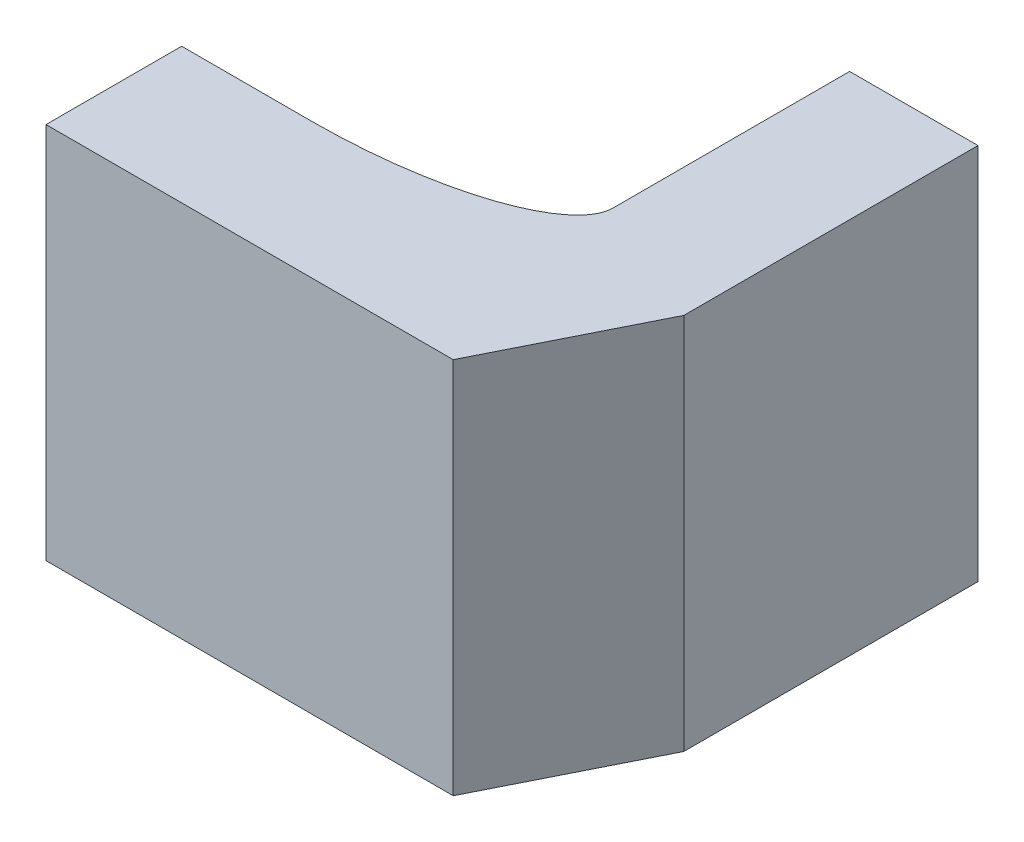
ISO-10303-21;
HEADER;
FILE_DESCRIPTION(('STEP AP214'),'2;1');
FILE_NAME('part.step','',(''),(''),'','','');
FILE_SCHEMA(('AUTOMOTIVE_DESIGN { 1 0 10303 214 1 1 1 1 }'));
ENDSEC;
DATA;
#1=APPLICATION_CONTEXT('core data for automotive mechanical design processes');
#2=APPLICATION_PROTOCOL_DEFINITION('international standard','automotive_design',2000,#1);
#3=PRODUCT_CONTEXT('',#1,'mechanical');
#4=PRODUCT('Part','Part','',(#3));
#5=PRODUCT_RELATED_PRODUCT_CATEGORY('part','',(#4));
#6=PRODUCT_DEFINITION_FORMATION('','',#4);
#7=PRODUCT_DEFINITION_CONTEXT('part definition',#1,'design');
#8=PRODUCT_DEFINITION('design','',#6,#7);
#9=PRODUCT_DEFINITION_SHAPE('','',#8);
#10=(LENGTH_UNIT() NAMED_UNIT(*) SI_UNIT(.MILLI.,.METRE.));
#11=(NAMED_UNIT(*) PLANE_ANGLE_UNIT() SI_UNIT($,.RADIAN.));
#12=(NAMED_UNIT(*) SI_UNIT($,.STERADIAN.) SOLID_ANGLE_UNIT());
#13=UNCERTAINTY_MEASURE_WITH_UNIT(LENGTH_MEASURE(1.E-05),#10,'distance_accuracy_value','');
#14=(GEOMETRIC_REPRESENTATION_CONTEXT(3) GLOBAL_UNCERTAINTY_ASSIGNED_CONTEXT((#13)) GLOBAL_UNIT_ASSIGNED_CONTEXT((#10,
#11,#12)) REPRESENTATION_CONTEXT('',''));
#15=CARTESIAN_POINT('',(0.,0.,0.));
#16=DIRECTION('',(0.,0.,1.));
#17=DIRECTION('',(1.,0.,0.));
#18=AXIS2_PLACEMENT_3D('',#15,#16,#17);
#19=CARTESIAN_POINT('',(0.,50.,-17.959481216458));
#20=DIRECTION('',(1.,0.,0.));
#21=DIRECTION('',(0.,0.,-1.));
#22=AXIS2_PLACEMENT_3D('',#19,#20,#21);
#23=PLANE('',#22);
#24=DIRECTION('',(0.,0.,1.));
#25=VECTOR('',#24,1.);
#26=CARTESIAN_POINT('',(0.,0.,-17.959481216458));
#27=LINE('',#26,#25);
#28=CARTESIAN_POINT('',(0.,0.,-17.959481216458));
#29=VERTEX_POINT('',#28);
#30=CARTESIAN_POINT('',(0.,0.,0.));
#31=VERTEX_POINT('',#30);
#32=EDGE_CURVE('E136',#29,#31,#27,.T.);
#33=ORIENTED_EDGE('',*,*,#32,.T.);
#34=DIRECTION('',(0.,-1.,0.));
#35=VECTOR('',#34,1.);
#36=CARTESIAN_POINT('',(0.,50.,0.));
#37=LINE('',#36,#35);
#38=CARTESIAN_POINT('',(0.,50.,0.));
#39=VERTEX_POINT('',#38);
#40=EDGE_CURVE('E122',#39,#31,#37,.T.);
#41=ORIENTED_EDGE('',*,*,#40,.F.);
#42=DIRECTION('',(0.,0.,1.));
#43=VECTOR('',#42,1.);
#44=CARTESIAN_POINT('',(0.,50.,-17.959481216458));
#45=LINE('',#44,#43);
#46=CARTESIAN_POINT('',(0.,50.,-17.959481216458));
#47=VERTEX_POINT('',#46);
#48=EDGE_CURVE('E129',#47,#39,#45,.T.);
#49=ORIENTED_EDGE('',*,*,#48,.F.);
#50=DIRECTION('',(0.,-1.,0.));
#51=VECTOR('',#50,1.);
#52=CARTESIAN_POINT('',(0.,50.,-17.959481216458));
#53=LINE('',#52,#51);
#54=EDGE_CURVE('E157',#47,#29,#53,.T.);
#55=ORIENTED_EDGE('',*,*,#54,.T.);
#56=EDGE_LOOP('',(#33,#41,#49,#55));
#57=FACE_BOUND('',#56,.T.);
#58=ADVANCED_FACE('F42',(#57),#23,.F.);
#59=CARTESIAN_POINT('',(0.,50.,0.));
#60=DIRECTION('',(0.,0.,-1.));
#61=DIRECTION('',(-1.,0.,0.));
#62=AXIS2_PLACEMENT_3D('',#59,#60,#61);
#63=PLANE('',#62);
#64=DIRECTION('',(1.,0.,0.));
#65=VECTOR('',#64,1.);
#66=CARTESIAN_POINT('',(0.,0.,0.));
#67=LINE('',#66,#65);
#68=CARTESIAN_POINT('',(53.9091998294495,0.,0.));
#69=VERTEX_POINT('',#68);
#70=EDGE_CURVE('E181',#31,#69,#67,.T.);
#71=ORIENTED_EDGE('',*,*,#70,.T.);
#72=DIRECTION('',(0.,-1.,0.));
#73=VECTOR('',#72,1.);
#74=CARTESIAN_POINT('',(53.9091998294495,50.,0.));
#75=LINE('',#74,#73);
#76=CARTESIAN_POINT('',(53.9091998294495,50.,0.));
#77=VERTEX_POINT('',#76);
#78=EDGE_CURVE('E121',#77,#69,#75,.T.);
#79=ORIENTED_EDGE('',*,*,#78,.F.);
#80=DIRECTION('',(1.,0.,0.));
#81=VECTOR('',#80,1.);
#82=CARTESIAN_POINT('',(0.,50.,0.));
#83=LINE('',#82,#81);
#84=EDGE_CURVE('E120',#39,#77,#83,.T.);
#85=ORIENTED_EDGE('',*,*,#84,.F.);
#86=ORIENTED_EDGE('',*,*,#40,.T.);
#87=EDGE_LOOP('',(#71,#79,#85,#86));
#88=FACE_BOUND('',#87,.T.);
#89=ADVANCED_FACE('F118',(#88),#63,.F.);
#90=CARTESIAN_POINT('',(53.9091998294495,50.,0.));
#91=DIRECTION('',(-0.894084951768094,0.,-0.447897420200033));
#92=DIRECTION('',(-0.447897420200033,0.,0.894084951768094));
#93=AXIS2_PLACEMENT_3D('',#90,#91,#92);
#94=PLANE('',#93);
#95=DIRECTION('',(0.447897420200033,0.,-0.894084951768094));
#96=VECTOR('',#95,1.);
#97=CARTESIAN_POINT('',(53.9091998294495,0.,0.));
#98=LINE('',#97,#96);
#99=CARTESIAN_POINT('',(64.0964881049183,0.,-20.335685662919));
#100=VERTEX_POINT('',#99);
#101=EDGE_CURVE('E178',#69,#100,#98,.T.);
#102=ORIENTED_EDGE('',*,*,#101,.T.);
#103=DIRECTION('',(0.,-1.,0.));
#104=VECTOR('',#103,1.);
#105=CARTESIAN_POINT('',(64.0964881049183,50.,-20.335685662919));
#106=LINE('',#105,#104);
#107=CARTESIAN_POINT('',(64.0964881049183,50.,-20.335685662919));
#108=VERTEX_POINT('',#107);
#109=EDGE_CURVE('E144',#108,#100,#106,.T.);
#110=ORIENTED_EDGE('',*,*,#109,.F.);
#111=DIRECTION('',(0.447897420200033,0.,-0.894084951768094));
#112=VECTOR('',#111,1.);
#113=CARTESIAN_POINT('',(53.9091998294495,50.,0.));
#114=LINE('',#113,#112);
#115=EDGE_CURVE('E130',#77,#108,#114,.T.);
#116=ORIENTED_EDGE('',*,*,#115,.F.);
#117=ORIENTED_EDGE('',*,*,#78,.T.);
#118=EDGE_LOOP('',(#102,#110,#116,#117));
#119=FACE_BOUND('',#118,.T.);
#120=ADVANCED_FACE('F218',(#119),#94,.F.);
#121=CARTESIAN_POINT('',(64.0964881049183,50.,-20.335685662919));
#122=DIRECTION('',(-1.,0.,0.));
#123=DIRECTION('',(0.,0.,1.));
#124=AXIS2_PLACEMENT_3D('',#121,#122,#123);
#125=PLANE('',#124);
#126=DIRECTION('',(0.,0.,-1.));
#127=VECTOR('',#126,1.);
#128=CARTESIAN_POINT('',(64.0964881049183,0.,-20.335685662919));
#129=LINE('',#128,#127);
#130=CARTESIAN_POINT('',(64.0964881049183,0.,-59.2855992844365));
#131=VERTEX_POINT('',#130);
#132=EDGE_CURVE('E175',#100,#131,#129,.T.);
#133=ORIENTED_EDGE('',*,*,#132,.T.);
#134=DIRECTION('',(0.,-1.,0.));
#135=VECTOR('',#134,1.);
#136=CARTESIAN_POINT('',(64.0964881049183,50.,-59.2855992844365));
#137=LINE('',#136,#135);
#138=CARTESIAN_POINT('',(64.0964881049183,50.,-59.2855992844365));
#139=VERTEX_POINT('',#138);
#140=EDGE_CURVE('E161',#139,#131,#137,.T.);
#141=ORIENTED_EDGE('',*,*,#140,.F.);
#142=DIRECTION('',(0.,0.,-1.));
#143=VECTOR('',#142,1.);
#144=CARTESIAN_POINT('',(64.0964881049183,50.,-20.335685662919));
#145=LINE('',#144,#143);
#146=EDGE_CURVE('E173',#108,#139,#145,.T.);
#147=ORIENTED_EDGE('',*,*,#146,.F.);
#148=ORIENTED_EDGE('',*,*,#109,.T.);
#149=EDGE_LOOP('',(#133,#141,#147,#148));
#150=FACE_BOUND('',#149,.T.);
#151=ADVANCED_FACE('F167',(#150),#125,.F.);
#152=CARTESIAN_POINT('',(64.0964881049183,50.,-59.2855992844365));
#153=DIRECTION('',(0.,0.,1.));
#154=DIRECTION('',(1.,0.,0.));
#155=AXIS2_PLACEMENT_3D('',#152,#153,#154);
#156=PLANE('',#155);
#157=DIRECTION('',(-1.,0.,0.));
#158=VECTOR('',#157,1.);
#159=CARTESIAN_POINT('',(64.0964881049183,0.,-59.2855992844365));
#160=LINE('',#159,#158);
#161=CARTESIAN_POINT('',(47.1025703947216,0.,-59.2855992844365));
#162=VERTEX_POINT('',#161);
#163=EDGE_CURVE('E177',#131,#162,#160,.T.);
#164=ORIENTED_EDGE('',*,*,#163,.T.);
#165=DIRECTION('',(0.,-1.,0.));
#166=VECTOR('',#165,1.);
#167=CARTESIAN_POINT('',(47.1025703947216,50.,-59.2855992844365));
#168=LINE('',#167,#166);
#169=CARTESIAN_POINT('',(47.1025703947216,50.,-59.2855992844365));
#170=VERTEX_POINT('',#169);
#171=EDGE_CURVE('E156',#170,#162,#168,.T.);
#172=ORIENTED_EDGE('',*,*,#171,.F.);
#173=DIRECTION('',(-1.,0.,0.));
#174=VECTOR('',#173,1.);
#175=CARTESIAN_POINT('',(64.0964881049183,50.,-59.2855992844365));
#176=LINE('',#175,#174);
#177=EDGE_CURVE('E186',#139,#170,#176,.T.);
#178=ORIENTED_EDGE('',*,*,#177,.F.);
#179=ORIENTED_EDGE('',*,*,#140,.T.);
#180=EDGE_LOOP('',(#164,#172,#178,#179));
#181=FACE_BOUND('',#180,.T.);
#182=ADVANCED_FACE('F212',(#181),#156,.F.);
#183=CARTESIAN_POINT('',(47.1025703947216,50.,-17.959481216458));
#184=DIRECTION('',(1.,0.,0.));
#185=DIRECTION('',(0.,0.,-1.));
#186=AXIS2_PLACEMENT_3D('',#183,#184,#185);
#187=PLANE('',#186);
#188=DIRECTION('',(0.,0.,1.));
#189=VECTOR('',#188,1.);
#190=CARTESIAN_POINT('',(47.1025703947216,0.,-17.959481216458));
#191=LINE('',#190,#189);
#192=CARTESIAN_POINT('',(47.1025703947216,0.,-37.9619154763347));
#193=VERTEX_POINT('',#192);
#194=EDGE_CURVE('E148',#162,#193,#191,.T.);
#195=ORIENTED_EDGE('',*,*,#194,.T.);
#196=CARTESIAN_POINT('',(47.1025703947216,52.5000000000001,-27.959481216458));
#197=CARTESIAN_POINT('',(47.1025703947216,51.3541666666688,-27.959481216458));
#198=CARTESIAN_POINT('',(47.1025703947216,50.2083333333307,-27.9445984041427));
#199=CARTESIAN_POINT('',(47.1025703947216,47.9166666666694,-27.9951941068982));
#200=CARTESIAN_POINT('',(47.1025703947216,46.7708333333267,-28.0659851228949));
#201=CARTESIAN_POINT('',(47.1025703947216,43.3333333333467,-28.395340591084));
#202=CARTESIAN_POINT('',(47.1025703947216,41.0416666666692,-28.7708874668256));
#203=CARTESIAN_POINT('',(47.1025703947216,34.1666666666615,-30.2094812157227));
#204=CARTESIAN_POINT('',(47.1025703947216,29.5833333333305,-31.5844812171815));
#205=CARTESIAN_POINT('',(47.1025703947216,20.4166666666695,-34.3344812157344));
#206=CARTESIAN_POINT('',(47.1025703947216,15.8333333333384,-35.7094812171694));
#207=CARTESIAN_POINT('',(47.1025703947216,8.95833333333078,-37.1480749661023));
#208=CARTESIAN_POINT('',(47.1025703947216,6.6666666666692,-37.523621841816));
#209=CARTESIAN_POINT('',(47.1025703947216,3.22916666666538,-37.8529773100289));
#210=CARTESIAN_POINT('',(47.1025703947216,2.08333333332267,-37.9237683260137));
#211=CARTESIAN_POINT('',(47.1025703947216,-0.208333333322687,-37.9743640287772));
#212=CARTESIAN_POINT('',(47.1025703947216,-1.35416666667469,-37.959481216458));
#213=CARTESIAN_POINT('',(47.1025703947216,-2.5,-37.959481216458));
#214=(BOUNDED_CURVE() B_SPLINE_CURVE(3,(#196,#197,#198,#199,#200,#201,#202,#203,#204,#205,#206,
#207,#208,#209,#210,#211,#212,#213),.UNSPECIFIED.,.F.,.F.) B_SPLINE_CURVE_WITH_KNOTS((4,2,2,2,2,
2,2,2,4),(0.0416666666666664,0.0989583333333331,0.15625,0.270833333333333,0.5,0.729166666666668,
0.843750000000001,0.901041666666668,0.958333333333335),
.UNSPECIFIED.) CURVE() GEOMETRIC_REPRESENTATION_ITEM() RATIONAL_B_SPLINE_CURVE((1.,1.,1.,1.,1.,
1.,1.,1.,1.,1.,1.,1.,1.,1.,1.,1.,1.,1.)) REPRESENTATION_ITEM(''));
#215=CARTESIAN_POINT('',(47.1025703947216,50.,-27.957046956583));
#216=VERTEX_POINT('',#215);
#217=EDGE_CURVE('E63',#193,#216,#214,.F.);
#218=ORIENTED_EDGE('',*,*,#217,.T.);
#219=DIRECTION('',(0.,0.,1.));
#220=VECTOR('',#219,1.);
#221=CARTESIAN_POINT('',(47.1025703947216,50.,-17.959481216458));
#222=LINE('',#221,#220);
#223=EDGE_CURVE('E195',#170,#216,#222,.T.);
#224=ORIENTED_EDGE('',*,*,#223,.F.);
#225=ORIENTED_EDGE('',*,*,#171,.T.);
#226=EDGE_LOOP('',(#195,#218,#224,#225));
#227=FACE_BOUND('',#226,.T.);
#228=ADVANCED_FACE('F199',(#227),#187,.F.);
#229=CARTESIAN_POINT('',(47.1025703947216,50.,-17.959481216458));
#230=DIRECTION('',(0.,0.,1.));
#231=DIRECTION('',(1.,0.,0.));
#232=AXIS2_PLACEMENT_3D('',#229,#230,#231);
#233=PLANE('',#232);
#234=DIRECTION('',(-1.,0.,0.));
#235=VECTOR('',#234,1.);
#236=CARTESIAN_POINT('',(47.1025703947216,50.,-17.959481216458));
#237=LINE('',#236,#235);
#238=CARTESIAN_POINT('',(17.1001361348466,50.,-17.959481216458));
#239=VERTEX_POINT('',#238);
#240=EDGE_CURVE('E132',#239,#47,#237,.T.);
#241=ORIENTED_EDGE('',*,*,#240,.F.);
#242=CARTESIAN_POINT('',(27.1025703947216,-2.5,-17.959481216458));
#243=CARTESIAN_POINT('',(27.1025703947216,-1.35416666667469,-17.959481216458));
#244=CARTESIAN_POINT('',(27.1174532070348,-0.208333333322687,-17.959481216458));
#245=CARTESIAN_POINT('',(27.0668575042833,2.08333333332267,-17.959481216458));
#246=CARTESIAN_POINT('',(26.9960664882826,3.22916666666538,-17.959481216458));
#247=CARTESIAN_POINT('',(26.6667110200995,6.6666666666692,-17.959481216458));
#248=CARTESIAN_POINT('',(26.29116414435,8.95833333333078,-17.959481216458));
#249=CARTESIAN_POINT('',(24.8525703954648,15.8333333333384,-17.959481216458));
#250=CARTESIAN_POINT('',(23.477570393998,20.4166666666695,-17.959481216458));
#251=CARTESIAN_POINT('',(20.7275703954451,29.5833333333305,-17.959481216458));
#252=CARTESIAN_POINT('',(19.3525703940022,34.1666666666615,-17.959481216458));
#253=CARTESIAN_POINT('',(17.9139766450812,41.0416666666692,-17.959481216458));
#254=CARTESIAN_POINT('',(17.5384297693635,43.3333333333467,-17.959481216458));
#255=CARTESIAN_POINT('',(17.2090743011506,46.7708333333267,-17.959481216458));
#256=CARTESIAN_POINT('',(17.1382832851618,47.9166666666694,-17.959481216458));
#257=CARTESIAN_POINT('',(17.0876875824063,50.2083333333307,-17.959481216458));
#258=CARTESIAN_POINT('',(17.1025703947216,51.3541666666688,-17.959481216458));
#259=CARTESIAN_POINT('',(17.1025703947216,52.5000000000001,-17.959481216458));
#260=(BOUNDED_CURVE() B_SPLINE_CURVE(3,(#242,#243,#244,#245,#246,#247,#248,#249,#250,#251,#252,
#253,#254,#255,#256,#257,#258,#259),.UNSPECIFIED.,.F.,.F.) B_SPLINE_CURVE_WITH_KNOTS((4,2,2,2,2,
2,2,2,4),(0.0416666666666663,0.098958333333333,0.15625,0.270833333333333,0.5,0.729166666666667,
0.843750000000001,0.901041666666668,0.958333333333334),
.UNSPECIFIED.) CURVE() GEOMETRIC_REPRESENTATION_ITEM() RATIONAL_B_SPLINE_CURVE((1.,1.,1.,1.,1.,
1.,1.,1.,1.,1.,1.,1.,1.,1.,1.,1.,1.,1.)) REPRESENTATION_ITEM(''));
#261=CARTESIAN_POINT('',(27.1050046545957,0.,-17.959481216458));
#262=VERTEX_POINT('',#261);
#263=EDGE_CURVE('E142',#239,#262,#260,.F.);
#264=ORIENTED_EDGE('',*,*,#263,.T.);
#265=DIRECTION('',(-1.,0.,0.));
#266=VECTOR('',#265,1.);
#267=CARTESIAN_POINT('',(47.1025703947216,0.,-17.959481216458));
#268=LINE('',#267,#266);
#269=EDGE_CURVE('E139',#262,#29,#268,.T.);
#270=ORIENTED_EDGE('',*,*,#269,.T.);
#271=ORIENTED_EDGE('',*,*,#54,.F.);
#272=EDGE_LOOP('',(#241,#264,#270,#271));
#273=FACE_BOUND('',#272,.T.);
#274=ADVANCED_FACE('F208',(#273),#233,.F.);
#275=CARTESIAN_POINT('',(0.,50.,0.));
#276=DIRECTION('',(0.,1.,0.));
#277=DIRECTION('',(0.,0.,1.));
#278=AXIS2_PLACEMENT_3D('',#275,#276,#277);
#279=PLANE('',#278);
#280=ORIENTED_EDGE('',*,*,#48,.T.);
#281=ORIENTED_EDGE('',*,*,#84,.T.);
#282=ORIENTED_EDGE('',*,*,#115,.T.);
#283=ORIENTED_EDGE('',*,*,#146,.T.);
#284=ORIENTED_EDGE('',*,*,#177,.T.);
#285=ORIENTED_EDGE('',*,*,#223,.T.);
#286=CARTESIAN_POINT('',(17.1001361348466,49.9999999999998,-17.959481216458));
#287=CARTESIAN_POINT('',(47.1025703947216,50.000000000001,-17.959481216458));
#288=CARTESIAN_POINT('',(47.1025703947216,49.9999999999998,-27.957046956583));
#289=(BOUNDED_CURVE() B_SPLINE_CURVE(2,(#286,#287,#288),.UNSPECIFIED.,.F.,
.F.) B_SPLINE_CURVE_WITH_KNOTS((3,3),(0.,1.),
.UNSPECIFIED.) CURVE() GEOMETRIC_REPRESENTATION_ITEM() RATIONAL_B_SPLINE_CURVE((1.,
0.707106781186547,1.)) REPRESENTATION_ITEM(''));
#290=EDGE_CURVE('E12',#216,#239,#289,.F.);
#291=ORIENTED_EDGE('',*,*,#290,.T.);
#292=ORIENTED_EDGE('',*,*,#240,.T.);
#293=EDGE_LOOP('',(#280,#281,#282,#283,#284,#285,#291,#292));
#294=FACE_BOUND('',#293,.T.);
#295=ADVANCED_FACE('F131',(#294),#279,.T.);
#296=CARTESIAN_POINT('',(0.,0.,0.));
#297=DIRECTION('',(0.,1.,0.));
#298=DIRECTION('',(0.,0.,1.));
#299=AXIS2_PLACEMENT_3D('',#296,#297,#298);
#300=PLANE('',#299);
#301=ORIENTED_EDGE('',*,*,#32,.F.);
#302=ORIENTED_EDGE('',*,*,#269,.F.);
#303=CARTESIAN_POINT('',(47.1025703947216,-1.20048285548457E-13,-37.9619154763347));
#304=CARTESIAN_POINT('',(47.1025703947216,4.61559650757113E-13,-17.9594812164588));
#305=CARTESIAN_POINT('',(27.1050046545957,-1.20319336091579E-13,-17.959481216458));
#306=(BOUNDED_CURVE() B_SPLINE_CURVE(2,(#303,#304,#305),.UNSPECIFIED.,.F.,
.F.) B_SPLINE_CURVE_WITH_KNOTS((3,3),(0.,1.),
.UNSPECIFIED.) CURVE() GEOMETRIC_REPRESENTATION_ITEM() RATIONAL_B_SPLINE_CURVE((1.,
0.707106781186548,1.)) REPRESENTATION_ITEM(''));
#307=EDGE_CURVE('E59',#262,#193,#306,.F.);
#308=ORIENTED_EDGE('',*,*,#307,.T.);
#309=ORIENTED_EDGE('',*,*,#194,.F.);
#310=ORIENTED_EDGE('',*,*,#163,.F.);
#311=ORIENTED_EDGE('',*,*,#132,.F.);
#312=ORIENTED_EDGE('',*,*,#101,.F.);
#313=ORIENTED_EDGE('',*,*,#70,.F.);
#314=EDGE_LOOP('',(#301,#302,#308,#309,#310,#311,#312,#313));
#315=FACE_BOUND('',#314,.T.);
#316=ADVANCED_FACE('F180',(#315),#300,.F.);
#317=CARTESIAN_POINT('',(17.1025703947216,52.5000000000001,-17.959481216458));
#318=CARTESIAN_POINT('',(17.1025703947216,51.3541666666688,-17.959481216458));
#319=CARTESIAN_POINT('',(17.0876875824063,50.2083333333307,-17.959481216458));
#320=CARTESIAN_POINT('',(17.1382832851618,47.9166666666694,-17.959481216458));
#321=CARTESIAN_POINT('',(17.2090743011506,46.7708333333267,-17.959481216458));
#322=CARTESIAN_POINT('',(17.5384297693635,43.3333333333467,-17.959481216458));
#323=CARTESIAN_POINT('',(17.9139766450812,41.0416666666692,-17.959481216458));
#324=CARTESIAN_POINT('',(19.3525703940022,34.1666666666615,-17.959481216458));
#325=CARTESIAN_POINT('',(20.7275703954451,29.5833333333305,-17.959481216458));
#326=CARTESIAN_POINT('',(23.477570393998,20.4166666666695,-17.959481216458));
#327=CARTESIAN_POINT('',(24.8525703954648,15.8333333333384,-17.959481216458));
#328=CARTESIAN_POINT('',(26.29116414435,8.95833333333078,-17.959481216458));
#329=CARTESIAN_POINT('',(26.6667110200995,6.6666666666692,-17.959481216458));
#330=CARTESIAN_POINT('',(26.9960664882826,3.22916666666538,-17.959481216458));
#331=CARTESIAN_POINT('',(27.0668575042833,2.08333333332267,-17.959481216458));
#332=CARTESIAN_POINT('',(27.1174532070348,-0.208333333322687,-17.959481216458));
#333=CARTESIAN_POINT('',(27.1025703947216,-1.35416666667469,-17.959481216458));
#334=CARTESIAN_POINT('',(27.1025703947216,-2.5,-17.959481216458));
#335=CARTESIAN_POINT('',(47.1025703947216,52.5000000000001,-17.959481216458));
#336=CARTESIAN_POINT('',(47.1025703947216,51.3541666666658,-17.959481216458));
#337=CARTESIAN_POINT('',(47.1025703947216,50.2083333333347,-17.959481216458));
#338=CARTESIAN_POINT('',(47.1025703947216,47.9166666666655,-17.959481216458));
#339=CARTESIAN_POINT('',(47.1025703947216,46.7708333333227,-17.959481216458));
#340=CARTESIAN_POINT('',(47.1025703947216,43.3333333333547,-17.959481216458));
#341=CARTESIAN_POINT('',(47.1025703947216,41.0416666666692,-17.959481216458));
#342=CARTESIAN_POINT('',(47.1025703947216,34.1666666666615,-17.959481216458));
#343=CARTESIAN_POINT('',(47.1025703947216,29.5833333333225,-17.959481216458));
#344=CARTESIAN_POINT('',(47.1025703947216,20.4166666666775,-17.959481216458));
#345=CARTESIAN_POINT('',(47.1025703947216,15.8333333333384,-17.9594812164421));
#346=CARTESIAN_POINT('',(47.1025703947216,8.95833333333077,-17.9594812164659));
#347=CARTESIAN_POINT('',(47.1025703947216,6.66666666667417,-17.959481216454));
#348=CARTESIAN_POINT('',(47.1025703947216,3.22916666666289,-17.9594812164599));
#349=CARTESIAN_POINT('',(47.1025703947216,2.08333333332081,-17.959481216456));
#350=CARTESIAN_POINT('',(47.1025703947216,-0.20833333332082,-17.9594812164599));
#351=CARTESIAN_POINT('',(47.1025703947216,-1.35416666667609,-17.959481216458));
#352=CARTESIAN_POINT('',(47.1025703947216,-2.50000000000001,-17.959481216458));
#353=CARTESIAN_POINT('',(47.1025703947216,52.5000000000001,-27.959481216458));
#354=CARTESIAN_POINT('',(47.1025703947216,51.3541666666688,-27.959481216458));
#355=CARTESIAN_POINT('',(47.1025703947216,50.2083333333307,-27.9445984041427));
#356=CARTESIAN_POINT('',(47.1025703947216,47.9166666666694,-27.9951941068982));
#357=CARTESIAN_POINT('',(47.1025703947216,46.7708333333267,-28.0659851228949));
#358=CARTESIAN_POINT('',(47.1025703947216,43.3333333333467,-28.395340591084));
#359=CARTESIAN_POINT('',(47.1025703947216,41.0416666666692,-28.7708874668256));
#360=CARTESIAN_POINT('',(47.1025703947216,34.1666666666615,-30.2094812157227));
#361=CARTESIAN_POINT('',(47.1025703947216,29.5833333333305,-31.5844812171815));
#362=CARTESIAN_POINT('',(47.1025703947216,20.4166666666695,-34.3344812157344));
#363=CARTESIAN_POINT('',(47.1025703947216,15.8333333333384,-35.7094812171694));
#364=CARTESIAN_POINT('',(47.1025703947216,8.95833333333078,-37.1480749661023));
#365=CARTESIAN_POINT('',(47.1025703947216,6.6666666666692,-37.523621841816));
#366=CARTESIAN_POINT('',(47.1025703947216,3.22916666666538,-37.8529773100289));
#367=CARTESIAN_POINT('',(47.1025703947216,2.08333333332267,-37.9237683260137));
#368=CARTESIAN_POINT('',(47.1025703947216,-0.208333333322687,-37.9743640287772));
#369=CARTESIAN_POINT('',(47.1025703947216,-1.35416666667469,-37.959481216458));
#370=CARTESIAN_POINT('',(47.1025703947216,-2.5,-37.959481216458));
#371=(BOUNDED_SURFACE() B_SPLINE_SURFACE(2,3,((#317,#318,#319,#320,#321,#322,#323,#324,#325,
#326,#327,#328,#329,#330,#331,#332,#333,#334),(#335,#336,#337,#338,#339,#340,#341,#342,#343,
#344,#345,#346,#347,#348,#349,#350,#351,#352),(#353,#354,#355,#356,#357,#358,#359,#360,#361,
#362,#363,#364,#365,#366,#367,#368,#369,#370)),.UNSPECIFIED.,.F.,.F.,
.F.) B_SPLINE_SURFACE_WITH_KNOTS((3,3),(4,2,2,2,2,2,2,2,4),(0.,1.),(0.0416666666666664,
0.0989583333333331,0.15625,0.270833333333333,0.5,0.729166666666668,0.843750000000001,
0.901041666666668,0.958333333333335),
.UNSPECIFIED.) GEOMETRIC_REPRESENTATION_ITEM() RATIONAL_B_SPLINE_SURFACE(((1.,1.,1.,1.,1.,1.,1.,
1.,1.,1.,1.,1.,1.,1.,1.,1.,1.,1.),(0.707106781186547,0.707106781186547,0.707106781186548,
0.707106781186548,0.707106781186548,0.707106781186548,0.707106781186548,0.707106781186548,
0.707106781186547,0.707106781186547,0.707106781186548,0.707106781186548,0.707106781186547,
0.707106781186547,0.707106781186548,0.707106781186548,0.707106781186548,0.707106781186548),(1.,
1.,1.,1.,1.,1.,1.,1.,1.,1.,1.,1.,1.,1.,1.,1.,1.,1.))) REPRESENTATION_ITEM('') SURFACE());
#372=ORIENTED_EDGE('',*,*,#290,.F.);
#373=ORIENTED_EDGE('',*,*,#217,.F.);
#374=ORIENTED_EDGE('',*,*,#307,.F.);
#375=ORIENTED_EDGE('',*,*,#263,.F.);
#376=EDGE_LOOP('',(#372,#373,#374,#375));
#377=FACE_BOUND('',#376,.T.);
#378=ADVANCED_FACE('F50',(#377),#371,.T.);
#379=CLOSED_SHELL('',(#58,#89,#120,#151,#182,#228,#274,#295,#316,#378));
#380=MANIFOLD_SOLID_BREP('B2',#379);
#381=ADVANCED_BREP_SHAPE_REPRESENTATION('',(#18,#380),#14);
#382=SHAPE_DEFINITION_REPRESENTATION(#9,#381);
ENDSEC;
END-ISO-10303-21;
